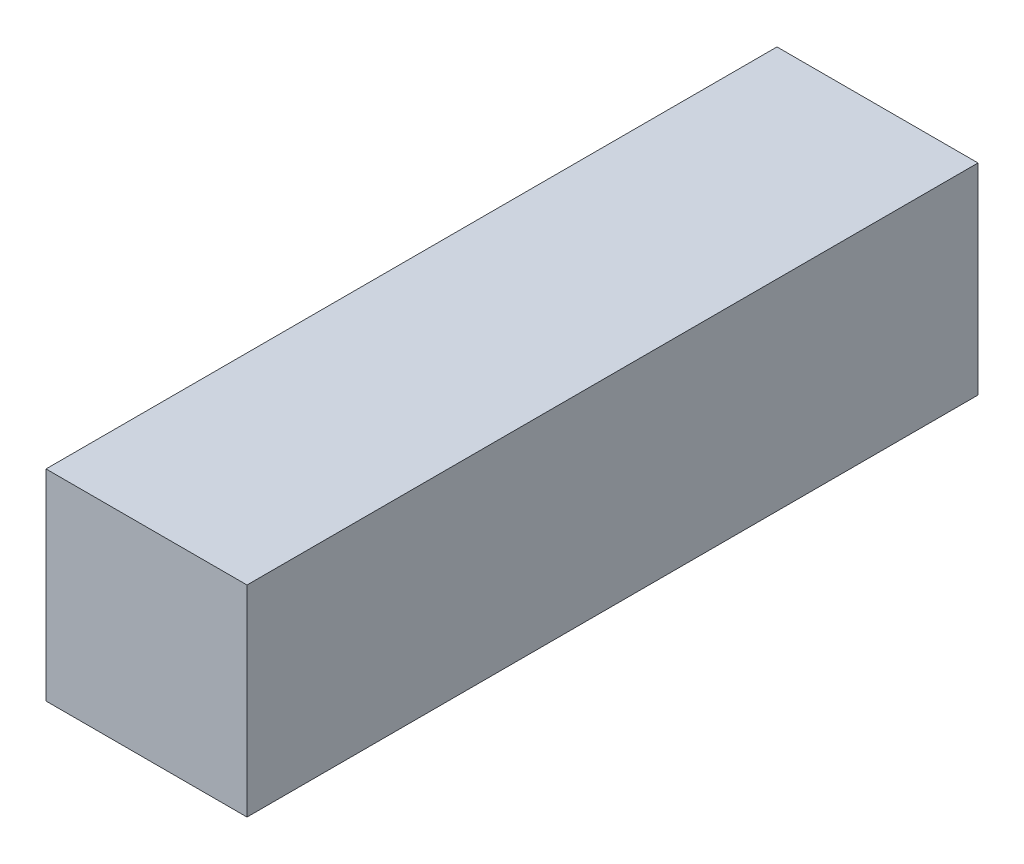
ISO-10303-21;
HEADER;
FILE_DESCRIPTION(('STEP AP214'),'2;1');
FILE_NAME('part.step','',(''),(''),'','','');
FILE_SCHEMA(('AUTOMOTIVE_DESIGN { 1 0 10303 214 1 1 1 1 }'));
ENDSEC;
DATA;
#1=APPLICATION_CONTEXT('core data for automotive mechanical design processes');
#2=APPLICATION_PROTOCOL_DEFINITION('international standard','automotive_design',2000,#1);
#3=PRODUCT_CONTEXT('',#1,'mechanical');
#4=PRODUCT('Part','Part','',(#3));
#5=PRODUCT_RELATED_PRODUCT_CATEGORY('part','',(#4));
#6=PRODUCT_DEFINITION_FORMATION('','',#4);
#7=PRODUCT_DEFINITION_CONTEXT('part definition',#1,'design');
#8=PRODUCT_DEFINITION('design','',#6,#7);
#9=PRODUCT_DEFINITION_SHAPE('','',#8);
#10=(LENGTH_UNIT() NAMED_UNIT(*) SI_UNIT(.MILLI.,.METRE.));
#11=(NAMED_UNIT(*) PLANE_ANGLE_UNIT() SI_UNIT($,.RADIAN.));
#12=(NAMED_UNIT(*) SI_UNIT($,.STERADIAN.) SOLID_ANGLE_UNIT());
#13=UNCERTAINTY_MEASURE_WITH_UNIT(LENGTH_MEASURE(1.E-05),#10,'distance_accuracy_value','');
#14=(GEOMETRIC_REPRESENTATION_CONTEXT(3) GLOBAL_UNCERTAINTY_ASSIGNED_CONTEXT((#13)) GLOBAL_UNIT_ASSIGNED_CONTEXT((#10,
#11,#12)) REPRESENTATION_CONTEXT('',''));
#15=CARTESIAN_POINT('',(0.,0.,0.));
#16=DIRECTION('',(0.,0.,1.));
#17=DIRECTION('',(1.,0.,0.));
#18=AXIS2_PLACEMENT_3D('',#15,#16,#17);
#19=CARTESIAN_POINT('',(0.,0.,80.));
#20=DIRECTION('',(1.,0.,0.));
#21=DIRECTION('',(0.,1.,0.));
#22=AXIS2_PLACEMENT_3D('',#19,#20,#21);
#23=PLANE('',#22);
#24=DIRECTION('',(0.,-1.,0.));
#25=VECTOR('',#24,1.);
#26=CARTESIAN_POINT('',(0.,0.,0.));
#27=LINE('',#26,#25);
#28=CARTESIAN_POINT('',(0.,0.,0.));
#29=VERTEX_POINT('',#28);
#30=CARTESIAN_POINT('',(0.,-22.,0.));
#31=VERTEX_POINT('',#30);
#32=EDGE_CURVE('E96',#29,#31,#27,.T.);
#33=ORIENTED_EDGE('',*,*,#32,.T.);
#34=DIRECTION('',(0.,0.,-1.));
#35=VECTOR('',#34,1.);
#36=CARTESIAN_POINT('',(0.,-22.,80.));
#37=LINE('',#36,#35);
#38=CARTESIAN_POINT('',(0.,-22.,80.));
#39=VERTEX_POINT('',#38);
#40=EDGE_CURVE('E11',#39,#31,#37,.T.);
#41=ORIENTED_EDGE('',*,*,#40,.F.);
#42=DIRECTION('',(0.,-1.,0.));
#43=VECTOR('',#42,1.);
#44=CARTESIAN_POINT('',(0.,0.,80.));
#45=LINE('',#44,#43);
#46=CARTESIAN_POINT('',(0.,0.,80.));
#47=VERTEX_POINT('',#46);
#48=EDGE_CURVE('E84',#47,#39,#45,.T.);
#49=ORIENTED_EDGE('',*,*,#48,.F.);
#50=DIRECTION('',(0.,0.,-1.));
#51=VECTOR('',#50,1.);
#52=CARTESIAN_POINT('',(0.,0.,80.));
#53=LINE('',#52,#51);
#54=EDGE_CURVE('E92',#47,#29,#53,.T.);
#55=ORIENTED_EDGE('',*,*,#54,.T.);
#56=EDGE_LOOP('',(#33,#41,#49,#55));
#57=FACE_BOUND('',#56,.T.);
#58=ADVANCED_FACE('F33',(#57),#23,.F.);
#59=CARTESIAN_POINT('',(0.,-22.,80.));
#60=DIRECTION('',(0.,1.,0.));
#61=DIRECTION('',(0.,0.,1.));
#62=AXIS2_PLACEMENT_3D('',#59,#60,#61);
#63=PLANE('',#62);
#64=DIRECTION('',(1.,0.,0.));
#65=VECTOR('',#64,1.);
#66=CARTESIAN_POINT('',(0.,-22.,0.));
#67=LINE('',#66,#65);
#68=CARTESIAN_POINT('',(22.,-22.,0.));
#69=VERTEX_POINT('',#68);
#70=EDGE_CURVE('E88',#31,#69,#67,.T.);
#71=ORIENTED_EDGE('',*,*,#70,.T.);
#72=DIRECTION('',(0.,0.,-1.));
#73=VECTOR('',#72,1.);
#74=CARTESIAN_POINT('',(22.,-22.,80.));
#75=LINE('',#74,#73);
#76=CARTESIAN_POINT('',(22.,-22.,80.));
#77=VERTEX_POINT('',#76);
#78=EDGE_CURVE('E41',#77,#69,#75,.T.);
#79=ORIENTED_EDGE('',*,*,#78,.F.);
#80=DIRECTION('',(1.,0.,0.));
#81=VECTOR('',#80,1.);
#82=CARTESIAN_POINT('',(0.,-22.,80.));
#83=LINE('',#82,#81);
#84=EDGE_CURVE('E79',#39,#77,#83,.T.);
#85=ORIENTED_EDGE('',*,*,#84,.F.);
#86=ORIENTED_EDGE('',*,*,#40,.T.);
#87=EDGE_LOOP('',(#71,#79,#85,#86));
#88=FACE_BOUND('',#87,.T.);
#89=ADVANCED_FACE('F87',(#88),#63,.F.);
#90=CARTESIAN_POINT('',(22.,0.,80.));
#91=DIRECTION('',(-1.,0.,0.));
#92=DIRECTION('',(0.,-1.,0.));
#93=AXIS2_PLACEMENT_3D('',#90,#91,#92);
#94=PLANE('',#93);
#95=DIRECTION('',(0.,1.,0.));
#96=VECTOR('',#95,1.);
#97=CARTESIAN_POINT('',(22.,0.,0.));
#98=LINE('',#97,#96);
#99=CARTESIAN_POINT('',(22.,0.,0.));
#100=VERTEX_POINT('',#99);
#101=EDGE_CURVE('E66',#69,#100,#98,.T.);
#102=ORIENTED_EDGE('',*,*,#101,.T.);
#103=DIRECTION('',(0.,0.,-1.));
#104=VECTOR('',#103,1.);
#105=CARTESIAN_POINT('',(22.,0.,80.));
#106=LINE('',#105,#104);
#107=CARTESIAN_POINT('',(22.,0.,80.));
#108=VERTEX_POINT('',#107);
#109=EDGE_CURVE('E89',#108,#100,#106,.T.);
#110=ORIENTED_EDGE('',*,*,#109,.F.);
#111=DIRECTION('',(0.,1.,0.));
#112=VECTOR('',#111,1.);
#113=CARTESIAN_POINT('',(22.,0.,80.));
#114=LINE('',#113,#112);
#115=EDGE_CURVE('E82',#77,#108,#114,.T.);
#116=ORIENTED_EDGE('',*,*,#115,.F.);
#117=ORIENTED_EDGE('',*,*,#78,.T.);
#118=EDGE_LOOP('',(#102,#110,#116,#117));
#119=FACE_BOUND('',#118,.T.);
#120=ADVANCED_FACE('F90',(#119),#94,.F.);
#121=CARTESIAN_POINT('',(0.,0.,80.));
#122=DIRECTION('',(0.,-1.,0.));
#123=DIRECTION('',(0.,0.,-1.));
#124=AXIS2_PLACEMENT_3D('',#121,#122,#123);
#125=PLANE('',#124);
#126=DIRECTION('',(-1.,0.,0.));
#127=VECTOR('',#126,1.);
#128=CARTESIAN_POINT('',(0.,0.,0.));
#129=LINE('',#128,#127);
#130=EDGE_CURVE('E72',#100,#29,#129,.T.);
#131=ORIENTED_EDGE('',*,*,#130,.T.);
#132=ORIENTED_EDGE('',*,*,#54,.F.);
#133=DIRECTION('',(-1.,0.,0.));
#134=VECTOR('',#133,1.);
#135=CARTESIAN_POINT('',(0.,0.,80.));
#136=LINE('',#135,#134);
#137=EDGE_CURVE('E49',#108,#47,#136,.T.);
#138=ORIENTED_EDGE('',*,*,#137,.F.);
#139=ORIENTED_EDGE('',*,*,#109,.T.);
#140=EDGE_LOOP('',(#131,#132,#138,#139));
#141=FACE_BOUND('',#140,.T.);
#142=ADVANCED_FACE('F103',(#141),#125,.F.);
#143=CARTESIAN_POINT('',(0.,0.,80.));
#144=DIRECTION('',(0.,0.,1.));
#145=DIRECTION('',(1.,0.,0.));
#146=AXIS2_PLACEMENT_3D('',#143,#144,#145);
#147=PLANE('',#146);
#148=ORIENTED_EDGE('',*,*,#48,.T.);
#149=ORIENTED_EDGE('',*,*,#84,.T.);
#150=ORIENTED_EDGE('',*,*,#115,.T.);
#151=ORIENTED_EDGE('',*,*,#137,.T.);
#152=EDGE_LOOP('',(#148,#149,#150,#151));
#153=FACE_BOUND('',#152,.T.);
#154=ADVANCED_FACE('F80',(#153),#147,.T.);
#155=CARTESIAN_POINT('',(0.,0.,0.));
#156=DIRECTION('',(0.,0.,1.));
#157=DIRECTION('',(1.,0.,0.));
#158=AXIS2_PLACEMENT_3D('',#155,#156,#157);
#159=PLANE('',#158);
#160=ORIENTED_EDGE('',*,*,#32,.F.);
#161=ORIENTED_EDGE('',*,*,#130,.F.);
#162=ORIENTED_EDGE('',*,*,#101,.F.);
#163=ORIENTED_EDGE('',*,*,#70,.F.);
#164=EDGE_LOOP('',(#160,#161,#162,#163));
#165=FACE_BOUND('',#164,.T.);
#166=ADVANCED_FACE('F106',(#165),#159,.F.);
#167=CLOSED_SHELL('',(#58,#89,#120,#142,#154,#166));
#168=MANIFOLD_SOLID_BREP('B2',#167);
#169=ADVANCED_BREP_SHAPE_REPRESENTATION('',(#18,#168),#14);
#170=SHAPE_DEFINITION_REPRESENTATION(#9,#169);
ENDSEC;
END-ISO-10303-21;
